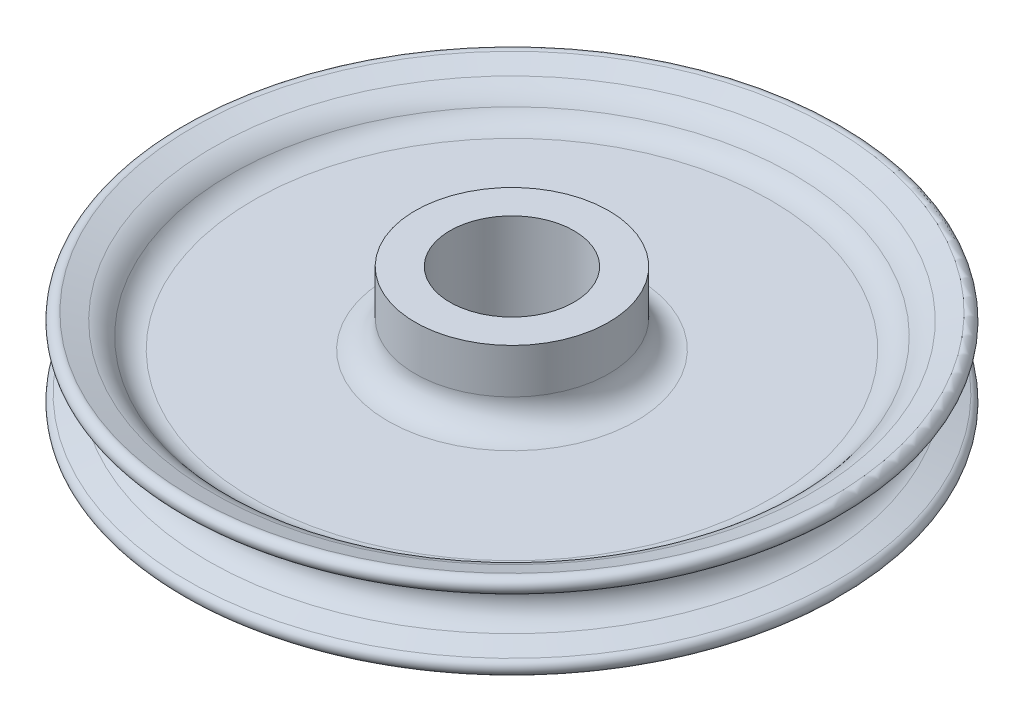
ISO-10303-21;
HEADER;
FILE_DESCRIPTION(('STEP AP214'),'2;1');
FILE_NAME('part.step','',(''),(''),'','','');
FILE_SCHEMA(('AUTOMOTIVE_DESIGN { 1 0 10303 214 1 1 1 1 }'));
ENDSEC;
DATA;
#1=APPLICATION_CONTEXT('core data for automotive mechanical design processes');
#2=APPLICATION_PROTOCOL_DEFINITION('international standard','automotive_design',2000,#1);
#3=PRODUCT_CONTEXT('',#1,'mechanical');
#4=PRODUCT('Part','Part','',(#3));
#5=PRODUCT_RELATED_PRODUCT_CATEGORY('part','',(#4));
#6=PRODUCT_DEFINITION_FORMATION('','',#4);
#7=PRODUCT_DEFINITION_CONTEXT('part definition',#1,'design');
#8=PRODUCT_DEFINITION('design','',#6,#7);
#9=PRODUCT_DEFINITION_SHAPE('','',#8);
#10=(LENGTH_UNIT() NAMED_UNIT(*) SI_UNIT(.MILLI.,.METRE.));
#11=(NAMED_UNIT(*) PLANE_ANGLE_UNIT() SI_UNIT($,.RADIAN.));
#12=(NAMED_UNIT(*) SI_UNIT($,.STERADIAN.) SOLID_ANGLE_UNIT());
#13=UNCERTAINTY_MEASURE_WITH_UNIT(LENGTH_MEASURE(1.E-05),#10,'distance_accuracy_value','');
#14=(GEOMETRIC_REPRESENTATION_CONTEXT(3) GLOBAL_UNCERTAINTY_ASSIGNED_CONTEXT((#13)) GLOBAL_UNIT_ASSIGNED_CONTEXT((#10,
#11,#12)) REPRESENTATION_CONTEXT('',''));
#15=CARTESIAN_POINT('',(0.,0.,0.));
#16=DIRECTION('',(0.,0.,1.));
#17=DIRECTION('',(1.,0.,0.));
#18=AXIS2_PLACEMENT_3D('',#15,#16,#17);
#19=CARTESIAN_POINT('',(0.,-66.,50.));
#20=DIRECTION('',(0.,1.,0.));
#21=DIRECTION('',(0.,0.,1.));
#22=AXIS2_PLACEMENT_3D('',#19,#20,#21);
#23=PLANE('',#22);
#24=CARTESIAN_POINT('',(0.,-65.9999999999999,0.));
#25=DIRECTION('',(0.,-1.,0.));
#26=DIRECTION('',(0.,0.,-1.));
#27=AXIS2_PLACEMENT_3D('',#24,#25,#26);
#28=CIRCLE('',#27,50.);
#29=CARTESIAN_POINT('',(0.,-65.9999999999999,-50.));
#30=VERTEX_POINT('',#29);
#31=EDGE_CURVE('E10',#30,#30,#28,.T.);
#32=ORIENTED_EDGE('',*,*,#31,.F.);
#33=EDGE_LOOP('',(#32));
#34=FACE_BOUND('',#33,.T.);
#35=CARTESIAN_POINT('',(0.,-65.9999999999999,0.));
#36=DIRECTION('',(0.,-1.,0.));
#37=DIRECTION('',(0.,0.,-1.));
#38=AXIS2_PLACEMENT_3D('',#35,#36,#37);
#39=CIRCLE('',#38,78.);
#40=CARTESIAN_POINT('',(0.,-65.9999999999999,-78.));
#41=VERTEX_POINT('',#40);
#42=EDGE_CURVE('E101',#41,#41,#39,.T.);
#43=ORIENTED_EDGE('',*,*,#42,.T.);
#44=EDGE_LOOP('',(#43));
#45=FACE_BOUND('',#44,.T.);
#46=ADVANCED_FACE('F37',(#34,#45),#23,.F.);
#47=CARTESIAN_POINT('',(0.,-389.412948614705,0.));
#48=DIRECTION('',(0.,-1.,0.));
#49=DIRECTION('',(0.,0.,-1.));
#50=AXIS2_PLACEMENT_3D('',#47,#48,#49);
#51=CYLINDRICAL_SURFACE('',#50,50.);
#52=CARTESIAN_POINT('',(0.,66.0000000000001,0.));
#53=DIRECTION('',(0.,-1.,0.));
#54=DIRECTION('',(0.,0.,-1.));
#55=AXIS2_PLACEMENT_3D('',#52,#53,#54);
#56=CIRCLE('',#55,50.);
#57=CARTESIAN_POINT('',(0.,66.0000000000001,-50.));
#58=VERTEX_POINT('',#57);
#59=EDGE_CURVE('E43',#58,#58,#56,.T.);
#60=ORIENTED_EDGE('',*,*,#59,.F.);
#61=EDGE_LOOP('',(#60));
#62=FACE_BOUND('',#61,.T.);
#63=ORIENTED_EDGE('',*,*,#31,.T.);
#64=EDGE_LOOP('',(#63));
#65=FACE_BOUND('',#64,.T.);
#66=ADVANCED_FACE('F210',(#62,#65),#51,.F.);
#67=CARTESIAN_POINT('',(0.,66.,78.));
#68=DIRECTION('',(0.,-1.,0.));
#69=DIRECTION('',(0.,0.,-1.));
#70=AXIS2_PLACEMENT_3D('',#67,#68,#69);
#71=PLANE('',#70);
#72=CARTESIAN_POINT('',(0.,66.0000000000001,0.));
#73=DIRECTION('',(0.,-1.,0.));
#74=DIRECTION('',(0.,0.,-1.));
#75=AXIS2_PLACEMENT_3D('',#72,#73,#74);
#76=CIRCLE('',#75,78.);
#77=CARTESIAN_POINT('',(0.,66.0000000000001,-78.));
#78=VERTEX_POINT('',#77);
#79=EDGE_CURVE('E47',#78,#78,#76,.T.);
#80=ORIENTED_EDGE('',*,*,#79,.F.);
#81=EDGE_LOOP('',(#80));
#82=FACE_BOUND('',#81,.T.);
#83=ORIENTED_EDGE('',*,*,#59,.T.);
#84=EDGE_LOOP('',(#83));
#85=FACE_BOUND('',#84,.T.);
#86=ADVANCED_FACE('F205',(#82,#85),#71,.F.);
#87=CARTESIAN_POINT('',(0.,-389.412948614705,0.));
#88=DIRECTION('',(0.,-1.,0.));
#89=DIRECTION('',(0.,0.,-1.));
#90=AXIS2_PLACEMENT_3D('',#87,#88,#89);
#91=CYLINDRICAL_SURFACE('',#90,78.);
#92=CARTESIAN_POINT('',(0.,30.,0.));
#93=DIRECTION('',(0.,-1.,0.));
#94=DIRECTION('',(0.,0.,-1.));
#95=AXIS2_PLACEMENT_3D('',#92,#93,#94);
#96=CIRCLE('',#95,78.);
#97=CARTESIAN_POINT('',(0.,30.,-78.));
#98=VERTEX_POINT('',#97);
#99=EDGE_CURVE('E51',#98,#98,#96,.T.);
#100=ORIENTED_EDGE('',*,*,#99,.F.);
#101=EDGE_LOOP('',(#100));
#102=FACE_BOUND('',#101,.T.);
#103=ORIENTED_EDGE('',*,*,#79,.T.);
#104=EDGE_LOOP('',(#103));
#105=FACE_BOUND('',#104,.T.);
#106=ADVANCED_FACE('F199',(#102,#105),#91,.T.);
#107=CARTESIAN_POINT('',(0.,30.,0.));
#108=DIRECTION('',(0.,-1.,0.));
#109=DIRECTION('',(0.,0.,-1.));
#110=AXIS2_PLACEMENT_3D('',#107,#108,#109);
#111=TOROIDAL_SURFACE('',#110,100.,22.);
#112=CARTESIAN_POINT('',(0.,8.00000000000001,0.));
#113=DIRECTION('',(0.,-1.,0.));
#114=DIRECTION('',(0.,0.,-1.));
#115=AXIS2_PLACEMENT_3D('',#112,#113,#114);
#116=CIRCLE('',#115,100.);
#117=CARTESIAN_POINT('',(0.,8.00000000000001,-100.));
#118=VERTEX_POINT('',#117);
#119=EDGE_CURVE('E56',#118,#118,#116,.T.);
#120=ORIENTED_EDGE('',*,*,#119,.F.);
#121=EDGE_LOOP('',(#120));
#122=FACE_BOUND('',#121,.T.);
#123=ORIENTED_EDGE('',*,*,#99,.T.);
#124=EDGE_LOOP('',(#123));
#125=FACE_BOUND('',#124,.T.);
#126=ADVANCED_FACE('F193',(#122,#125),#111,.F.);
#127=CARTESIAN_POINT('',(0.,7.99999999999998,208.526478836809));
#128=DIRECTION('',(0.,-1.,0.));
#129=DIRECTION('',(0.,0.,-1.));
#130=AXIS2_PLACEMENT_3D('',#127,#128,#129);
#131=PLANE('',#130);
#132=CARTESIAN_POINT('',(0.,8.00000000000001,0.));
#133=DIRECTION('',(0.,-1.,0.));
#134=DIRECTION('',(0.,0.,-1.));
#135=AXIS2_PLACEMENT_3D('',#132,#133,#134);
#136=CIRCLE('',#135,208.526478836809);
#137=CARTESIAN_POINT('',(0.,8.00000000000001,-208.526478836809));
#138=VERTEX_POINT('',#137);
#139=EDGE_CURVE('E59',#138,#138,#136,.T.);
#140=ORIENTED_EDGE('',*,*,#139,.F.);
#141=EDGE_LOOP('',(#140));
#142=FACE_BOUND('',#141,.T.);
#143=ORIENTED_EDGE('',*,*,#119,.T.);
#144=EDGE_LOOP('',(#143));
#145=FACE_BOUND('',#144,.T.);
#146=ADVANCED_FACE('F187',(#142,#145),#131,.F.);
#147=CARTESIAN_POINT('',(0.,30.,0.));
#148=DIRECTION('',(0.,-1.,0.));
#149=DIRECTION('',(0.,0.,-1.));
#150=AXIS2_PLACEMENT_3D('',#147,#148,#149);
#151=TOROIDAL_SURFACE('',#150,208.526478836809,22.);
#152=CARTESIAN_POINT('',(0.,17.3076923076923,0.));
#153=DIRECTION('',(0.,-1.,0.));
#154=DIRECTION('',(0.,0.,-1.));
#155=AXIS2_PLACEMENT_3D('',#152,#153,#154);
#156=CIRCLE('',#155,226.496045482775);
#157=CARTESIAN_POINT('',(0.,17.3076923076923,-226.496045482775));
#158=VERTEX_POINT('',#157);
#159=EDGE_CURVE('E62',#158,#158,#156,.T.);
#160=ORIENTED_EDGE('',*,*,#159,.F.);
#161=EDGE_LOOP('',(#160));
#162=FACE_BOUND('',#161,.T.);
#163=ORIENTED_EDGE('',*,*,#139,.T.);
#164=EDGE_LOOP('',(#163));
#165=FACE_BOUND('',#164,.T.);
#166=ADVANCED_FACE('F181',(#162,#165),#151,.F.);
#167=CARTESIAN_POINT('',(0.,0.,0.));
#168=DIRECTION('',(0.,-1.,0.));
#169=DIRECTION('',(0.,0.,-1.));
#170=AXIS2_PLACEMENT_3D('',#167,#168,#169);
#171=TOROIDAL_SURFACE('',#170,251.,30.);
#172=CARTESIAN_POINT('',(0.,28.3920232934934,0.));
#173=DIRECTION('',(0.,-1.,0.));
#174=DIRECTION('',(0.,0.,-1.));
#175=AXIS2_PLACEMENT_3D('',#172,#173,#174);
#176=CIRCLE('',#175,241.310159273666);
#177=CARTESIAN_POINT('',(0.,28.3920232934934,-241.310159273666));
#178=VERTEX_POINT('',#177);
#179=EDGE_CURVE('E65',#178,#178,#176,.T.);
#180=ORIENTED_EDGE('',*,*,#179,.F.);
#181=EDGE_LOOP('',(#180));
#182=FACE_BOUND('',#181,.T.);
#183=ORIENTED_EDGE('',*,*,#159,.T.);
#184=EDGE_LOOP('',(#183));
#185=FACE_BOUND('',#184,.T.);
#186=ADVANCED_FACE('F175',(#182,#185),#171,.T.);
#187=CARTESIAN_POINT('',(0.,28.3920232934934,0.));
#188=DIRECTION('',(0.,1.,0.));
#189=DIRECTION('',(0.,0.,1.));
#190=AXIS2_PLACEMENT_3D('',#187,#188,#189);
#191=CONICAL_SURFACE('',#190,241.310159273666,1.24190424639233);
#192=CARTESIAN_POINT('',(0.,34.,0.));
#193=DIRECTION('',(0.,-1.,0.));
#194=DIRECTION('',(0.,0.,-1.));
#195=AXIS2_PLACEMENT_3D('',#192,#193,#194);
#196=CIRCLE('',#195,257.74198821465);
#197=CARTESIAN_POINT('',(0.,34.,-257.74198821465));
#198=VERTEX_POINT('',#197);
#199=EDGE_CURVE('E68',#198,#198,#196,.T.);
#200=ORIENTED_EDGE('',*,*,#199,.F.);
#201=EDGE_LOOP('',(#200));
#202=FACE_BOUND('',#201,.T.);
#203=ORIENTED_EDGE('',*,*,#179,.T.);
#204=EDGE_LOOP('',(#203));
#205=FACE_BOUND('',#204,.T.);
#206=ADVANCED_FACE('F169',(#202,#205),#191,.F.);
#207=CARTESIAN_POINT('',(0.,28.3215953413013,0.));
#208=DIRECTION('',(0.,-1.,0.));
#209=DIRECTION('',(0.,0.,-1.));
#210=AXIS2_PLACEMENT_3D('',#207,#208,#209);
#211=TOROIDAL_SURFACE('',#210,259.679956359916,6.);
#212=CARTESIAN_POINT('',(0.,22.6431906826026,0.));
#213=DIRECTION('',(0.,-1.,0.));
#214=DIRECTION('',(0.,0.,-1.));
#215=AXIS2_PLACEMENT_3D('',#212,#213,#214);
#216=CIRCLE('',#215,261.617924505183);
#217=CARTESIAN_POINT('',(0.,22.6431906826026,-261.617924505183));
#218=VERTEX_POINT('',#217);
#219=EDGE_CURVE('E71',#218,#218,#216,.T.);
#220=ORIENTED_EDGE('',*,*,#219,.F.);
#221=EDGE_LOOP('',(#220));
#222=FACE_BOUND('',#221,.T.);
#223=ORIENTED_EDGE('',*,*,#199,.T.);
#224=EDGE_LOOP('',(#223));
#225=FACE_BOUND('',#224,.T.);
#226=ADVANCED_FACE('F163',(#222,#225),#211,.T.);
#227=CARTESIAN_POINT('',(0.,22.6431906826026,0.));
#228=DIRECTION('',(0.,1.,0.));
#229=DIRECTION('',(0.,0.,1.));
#230=AXIS2_PLACEMENT_3D('',#227,#228,#229);
#231=CONICAL_SURFACE('',#230,261.617924505183,1.24190424639233);
#232=CARTESIAN_POINT('',(0.,17.0352139760961,0.));
#233=DIRECTION('',(0.,-1.,0.));
#234=DIRECTION('',(0.,0.,-1.));
#235=AXIS2_PLACEMENT_3D('',#232,#233,#234);
#236=CIRCLE('',#235,245.186095564199);
#237=CARTESIAN_POINT('',(0.,17.0352139760961,-245.186095564199));
#238=VERTEX_POINT('',#237);
#239=EDGE_CURVE('E74',#238,#238,#236,.T.);
#240=ORIENTED_EDGE('',*,*,#239,.F.);
#241=EDGE_LOOP('',(#240));
#242=FACE_BOUND('',#241,.T.);
#243=ORIENTED_EDGE('',*,*,#219,.T.);
#244=EDGE_LOOP('',(#243));
#245=FACE_BOUND('',#244,.T.);
#246=ADVANCED_FACE('F157',(#242,#245),#231,.T.);
#247=CARTESIAN_POINT('',(0.,0.,0.));
#248=DIRECTION('',(0.,-1.,0.));
#249=DIRECTION('',(0.,0.,-1.));
#250=AXIS2_PLACEMENT_3D('',#247,#248,#249);
#251=TOROIDAL_SURFACE('',#250,251.,18.);
#252=CARTESIAN_POINT('',(0.,-17.0352139760961,0.));
#253=DIRECTION('',(0.,-1.,0.));
#254=DIRECTION('',(0.,0.,-1.));
#255=AXIS2_PLACEMENT_3D('',#252,#253,#254);
#256=CIRCLE('',#255,245.186095564199);
#257=CARTESIAN_POINT('',(0.,-17.0352139760961,-245.186095564199));
#258=VERTEX_POINT('',#257);
#259=EDGE_CURVE('E77',#258,#258,#256,.T.);
#260=ORIENTED_EDGE('',*,*,#259,.F.);
#261=EDGE_LOOP('',(#260));
#262=FACE_BOUND('',#261,.T.);
#263=ORIENTED_EDGE('',*,*,#239,.T.);
#264=EDGE_LOOP('',(#263));
#265=FACE_BOUND('',#264,.T.);
#266=ADVANCED_FACE('F151',(#262,#265),#251,.F.);
#267=CARTESIAN_POINT('',(0.,-17.0352139760961,0.));
#268=DIRECTION('',(0.,-1.,0.));
#269=DIRECTION('',(0.,0.,-1.));
#270=AXIS2_PLACEMENT_3D('',#267,#268,#269);
#271=CONICAL_SURFACE('',#270,245.186095564199,1.24190424639233);
#272=CARTESIAN_POINT('',(0.,-22.6431906826026,0.));
#273=DIRECTION('',(0.,-1.,0.));
#274=DIRECTION('',(0.,0.,-1.));
#275=AXIS2_PLACEMENT_3D('',#272,#273,#274);
#276=CIRCLE('',#275,261.617924505183);
#277=CARTESIAN_POINT('',(0.,-22.6431906826026,-261.617924505183));
#278=VERTEX_POINT('',#277);
#279=EDGE_CURVE('E80',#278,#278,#276,.T.);
#280=ORIENTED_EDGE('',*,*,#279,.F.);
#281=EDGE_LOOP('',(#280));
#282=FACE_BOUND('',#281,.T.);
#283=ORIENTED_EDGE('',*,*,#259,.T.);
#284=EDGE_LOOP('',(#283));
#285=FACE_BOUND('',#284,.T.);
#286=ADVANCED_FACE('F145',(#282,#285),#271,.T.);
#287=CARTESIAN_POINT('',(0.,-28.3215953413013,0.));
#288=DIRECTION('',(0.,-1.,0.));
#289=DIRECTION('',(0.,0.,-1.));
#290=AXIS2_PLACEMENT_3D('',#287,#288,#289);
#291=TOROIDAL_SURFACE('',#290,259.679956359916,6.00000000000001);
#292=CARTESIAN_POINT('',(0.,-34.,0.));
#293=DIRECTION('',(0.,-1.,0.));
#294=DIRECTION('',(0.,0.,-1.));
#295=AXIS2_PLACEMENT_3D('',#292,#293,#294);
#296=CIRCLE('',#295,257.74198821465);
#297=CARTESIAN_POINT('',(0.,-34.,-257.74198821465));
#298=VERTEX_POINT('',#297);
#299=EDGE_CURVE('E83',#298,#298,#296,.T.);
#300=ORIENTED_EDGE('',*,*,#299,.F.);
#301=EDGE_LOOP('',(#300));
#302=FACE_BOUND('',#301,.T.);
#303=ORIENTED_EDGE('',*,*,#279,.T.);
#304=EDGE_LOOP('',(#303));
#305=FACE_BOUND('',#304,.T.);
#306=ADVANCED_FACE('F139',(#302,#305),#291,.T.);
#307=CARTESIAN_POINT('',(0.,-34.,0.));
#308=DIRECTION('',(0.,-1.,0.));
#309=DIRECTION('',(0.,0.,-1.));
#310=AXIS2_PLACEMENT_3D('',#307,#308,#309);
#311=CONICAL_SURFACE('',#310,257.74198821465,1.24190424639233);
#312=CARTESIAN_POINT('',(0.,-28.3920232934934,0.));
#313=DIRECTION('',(0.,-1.,0.));
#314=DIRECTION('',(0.,0.,-1.));
#315=AXIS2_PLACEMENT_3D('',#312,#313,#314);
#316=CIRCLE('',#315,241.310159273666);
#317=CARTESIAN_POINT('',(0.,-28.3920232934934,-241.310159273666));
#318=VERTEX_POINT('',#317);
#319=EDGE_CURVE('E86',#318,#318,#316,.T.);
#320=ORIENTED_EDGE('',*,*,#319,.F.);
#321=EDGE_LOOP('',(#320));
#322=FACE_BOUND('',#321,.T.);
#323=ORIENTED_EDGE('',*,*,#299,.T.);
#324=EDGE_LOOP('',(#323));
#325=FACE_BOUND('',#324,.T.);
#326=ADVANCED_FACE('F133',(#322,#325),#311,.F.);
#327=CARTESIAN_POINT('',(0.,0.,0.));
#328=DIRECTION('',(0.,-1.,0.));
#329=DIRECTION('',(0.,0.,-1.));
#330=AXIS2_PLACEMENT_3D('',#327,#328,#329);
#331=TOROIDAL_SURFACE('',#330,251.,30.);
#332=CARTESIAN_POINT('',(0.,-17.3076923076923,0.));
#333=DIRECTION('',(0.,-1.,0.));
#334=DIRECTION('',(0.,0.,-1.));
#335=AXIS2_PLACEMENT_3D('',#332,#333,#334);
#336=CIRCLE('',#335,226.496045482775);
#337=CARTESIAN_POINT('',(0.,-17.3076923076923,-226.496045482775));
#338=VERTEX_POINT('',#337);
#339=EDGE_CURVE('E89',#338,#338,#336,.T.);
#340=ORIENTED_EDGE('',*,*,#339,.F.);
#341=EDGE_LOOP('',(#340));
#342=FACE_BOUND('',#341,.T.);
#343=ORIENTED_EDGE('',*,*,#319,.T.);
#344=EDGE_LOOP('',(#343));
#345=FACE_BOUND('',#344,.T.);
#346=ADVANCED_FACE('F127',(#342,#345),#331,.T.);
#347=CARTESIAN_POINT('',(0.,-30.,0.));
#348=DIRECTION('',(0.,-1.,0.));
#349=DIRECTION('',(0.,0.,-1.));
#350=AXIS2_PLACEMENT_3D('',#347,#348,#349);
#351=TOROIDAL_SURFACE('',#350,208.526478836809,22.);
#352=CARTESIAN_POINT('',(0.,-8.00000000000001,0.));
#353=DIRECTION('',(0.,-1.,0.));
#354=DIRECTION('',(0.,0.,-1.));
#355=AXIS2_PLACEMENT_3D('',#352,#353,#354);
#356=CIRCLE('',#355,208.526478836809);
#357=CARTESIAN_POINT('',(0.,-8.00000000000001,-208.526478836809));
#358=VERTEX_POINT('',#357);
#359=EDGE_CURVE('E92',#358,#358,#356,.T.);
#360=ORIENTED_EDGE('',*,*,#359,.F.);
#361=EDGE_LOOP('',(#360));
#362=FACE_BOUND('',#361,.T.);
#363=ORIENTED_EDGE('',*,*,#339,.T.);
#364=EDGE_LOOP('',(#363));
#365=FACE_BOUND('',#364,.T.);
#366=ADVANCED_FACE('F121',(#362,#365),#351,.F.);
#367=CARTESIAN_POINT('',(0.,-7.99999999999998,208.526478836809));
#368=DIRECTION('',(0.,1.,0.));
#369=DIRECTION('',(0.,0.,1.));
#370=AXIS2_PLACEMENT_3D('',#367,#368,#369);
#371=PLANE('',#370);
#372=CARTESIAN_POINT('',(0.,-7.99999999999995,0.));
#373=DIRECTION('',(0.,-1.,0.));
#374=DIRECTION('',(0.,0.,-1.));
#375=AXIS2_PLACEMENT_3D('',#372,#373,#374);
#376=CIRCLE('',#375,100.);
#377=CARTESIAN_POINT('',(0.,-7.99999999999995,-100.));
#378=VERTEX_POINT('',#377);
#379=EDGE_CURVE('E95',#378,#378,#376,.T.);
#380=ORIENTED_EDGE('',*,*,#379,.F.);
#381=EDGE_LOOP('',(#380));
#382=FACE_BOUND('',#381,.T.);
#383=ORIENTED_EDGE('',*,*,#359,.T.);
#384=EDGE_LOOP('',(#383));
#385=FACE_BOUND('',#384,.T.);
#386=ADVANCED_FACE('F115',(#382,#385),#371,.F.);
#387=CARTESIAN_POINT('',(0.,-30.,0.));
#388=DIRECTION('',(0.,-1.,0.));
#389=DIRECTION('',(0.,0.,-1.));
#390=AXIS2_PLACEMENT_3D('',#387,#388,#389);
#391=TOROIDAL_SURFACE('',#390,100.,22.);
#392=CARTESIAN_POINT('',(0.,-30.,0.));
#393=DIRECTION('',(0.,-1.,0.));
#394=DIRECTION('',(0.,0.,-1.));
#395=AXIS2_PLACEMENT_3D('',#392,#393,#394);
#396=CIRCLE('',#395,78.);
#397=CARTESIAN_POINT('',(0.,-30.,-78.));
#398=VERTEX_POINT('',#397);
#399=EDGE_CURVE('E98',#398,#398,#396,.T.);
#400=ORIENTED_EDGE('',*,*,#399,.F.);
#401=EDGE_LOOP('',(#400));
#402=FACE_BOUND('',#401,.T.);
#403=ORIENTED_EDGE('',*,*,#379,.T.);
#404=EDGE_LOOP('',(#403));
#405=FACE_BOUND('',#404,.T.);
#406=ADVANCED_FACE('F109',(#402,#405),#391,.F.);
#407=CARTESIAN_POINT('',(0.,-389.412948614705,0.));
#408=DIRECTION('',(0.,-1.,0.));
#409=DIRECTION('',(0.,0.,-1.));
#410=AXIS2_PLACEMENT_3D('',#407,#408,#409);
#411=CYLINDRICAL_SURFACE('',#410,78.);
#412=ORIENTED_EDGE('',*,*,#42,.F.);
#413=EDGE_LOOP('',(#412));
#414=FACE_BOUND('',#413,.T.);
#415=ORIENTED_EDGE('',*,*,#399,.T.);
#416=EDGE_LOOP('',(#415));
#417=FACE_BOUND('',#416,.T.);
#418=ADVANCED_FACE('F106',(#414,#417),#411,.T.);
#419=CLOSED_SHELL('',(#46,#66,#86,#106,#126,#146,#166,#186,#206,#226,#246,#266,#286,#306,#326,
#346,#366,#386,#406,#418));
#420=MANIFOLD_SOLID_BREP('B2',#419);
#421=ADVANCED_BREP_SHAPE_REPRESENTATION('',(#18,#420),#14);
#422=SHAPE_DEFINITION_REPRESENTATION(#9,#421);
ENDSEC;
END-ISO-10303-21;
